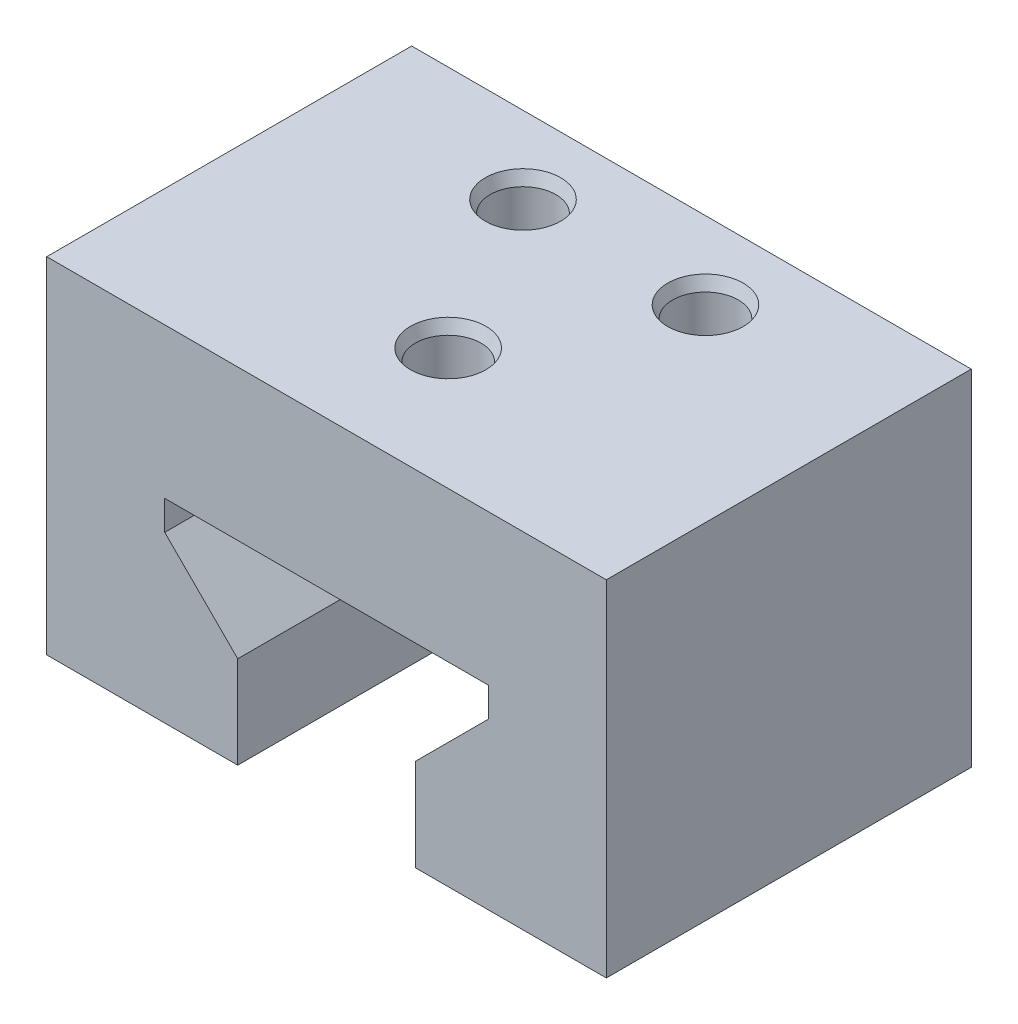
ISO-10303-21;
HEADER;
FILE_DESCRIPTION(('STEP AP214'),'2;1');
FILE_NAME('part.step','',(''),(''),'','','');
FILE_SCHEMA(('AUTOMOTIVE_DESIGN { 1 0 10303 214 1 1 1 1 }'));
ENDSEC;
DATA;
#1=APPLICATION_CONTEXT('core data for automotive mechanical design processes');
#2=APPLICATION_PROTOCOL_DEFINITION('international standard','automotive_design',2000,#1);
#3=PRODUCT_CONTEXT('',#1,'mechanical');
#4=PRODUCT('Part','Part','',(#3));
#5=PRODUCT_RELATED_PRODUCT_CATEGORY('part','',(#4));
#6=PRODUCT_DEFINITION_FORMATION('','',#4);
#7=PRODUCT_DEFINITION_CONTEXT('part definition',#1,'design');
#8=PRODUCT_DEFINITION('design','',#6,#7);
#9=PRODUCT_DEFINITION_SHAPE('','',#8);
#10=(LENGTH_UNIT() NAMED_UNIT(*) SI_UNIT(.MILLI.,.METRE.));
#11=(NAMED_UNIT(*) PLANE_ANGLE_UNIT() SI_UNIT($,.RADIAN.));
#12=(NAMED_UNIT(*) SI_UNIT($,.STERADIAN.) SOLID_ANGLE_UNIT());
#13=UNCERTAINTY_MEASURE_WITH_UNIT(LENGTH_MEASURE(1.E-05),#10,'distance_accuracy_value','');
#14=(GEOMETRIC_REPRESENTATION_CONTEXT(3) GLOBAL_UNCERTAINTY_ASSIGNED_CONTEXT((#13)) GLOBAL_UNIT_ASSIGNED_CONTEXT((#10,
#11,#12)) REPRESENTATION_CONTEXT('',''));
#15=CARTESIAN_POINT('',(0.,0.,0.));
#16=DIRECTION('',(0.,0.,1.));
#17=DIRECTION('',(1.,0.,0.));
#18=AXIS2_PLACEMENT_3D('',#15,#16,#17);
#19=CARTESIAN_POINT('',(23.,28.65,30.));
#20=DIRECTION('',(0.,-1.,0.));
#21=DIRECTION('',(0.,0.,-1.));
#22=AXIS2_PLACEMENT_3D('',#19,#20,#21);
#23=PLANE('',#22);
#24=CARTESIAN_POINT('',(0.,28.65,20.));
#25=DIRECTION('',(0.,1.,0.));
#26=DIRECTION('',(0.,0.,1.));
#27=AXIS2_PLACEMENT_3D('',#24,#25,#26);
#28=CIRCLE('',#27,3.10000000000001);
#29=CARTESIAN_POINT('',(0.,28.65,23.1));
#30=VERTEX_POINT('',#29);
#31=EDGE_CURVE('E324',#30,#30,#28,.T.);
#32=ORIENTED_EDGE('',*,*,#31,.F.);
#33=EDGE_LOOP('',(#32));
#34=FACE_BOUND('',#33,.T.);
#35=DIRECTION('',(-1.,0.,0.));
#36=VECTOR('',#35,1.);
#37=CARTESIAN_POINT('',(23.,28.65,0.));
#38=LINE('',#37,#36);
#39=CARTESIAN_POINT('',(23.,28.65,0.));
#40=VERTEX_POINT('',#39);
#41=CARTESIAN_POINT('',(-23.,28.65,0.));
#42=VERTEX_POINT('',#41);
#43=EDGE_CURVE('E100',#40,#42,#38,.T.);
#44=ORIENTED_EDGE('',*,*,#43,.T.);
#45=DIRECTION('',(0.,0.,-1.));
#46=VECTOR('',#45,1.);
#47=CARTESIAN_POINT('',(-23.,28.65,30.));
#48=LINE('',#47,#46);
#49=CARTESIAN_POINT('',(-23.,28.65,30.));
#50=VERTEX_POINT('',#49);
#51=EDGE_CURVE('E155',#50,#42,#48,.T.);
#52=ORIENTED_EDGE('',*,*,#51,.F.);
#53=DIRECTION('',(-1.,0.,0.));
#54=VECTOR('',#53,1.);
#55=CARTESIAN_POINT('',(23.,28.65,30.));
#56=LINE('',#55,#54);
#57=CARTESIAN_POINT('',(23.,28.65,30.));
#58=VERTEX_POINT('',#57);
#59=EDGE_CURVE('E143',#58,#50,#56,.T.);
#60=ORIENTED_EDGE('',*,*,#59,.F.);
#61=DIRECTION('',(0.,0.,-1.));
#62=VECTOR('',#61,1.);
#63=CARTESIAN_POINT('',(23.,28.65,30.));
#64=LINE('',#63,#62);
#65=EDGE_CURVE('E150',#58,#40,#64,.T.);
#66=ORIENTED_EDGE('',*,*,#65,.T.);
#67=EDGE_LOOP('',(#44,#52,#60,#66));
#68=FACE_BOUND('',#67,.T.);
#69=CARTESIAN_POINT('',(7.5,28.65,6.35));
#70=DIRECTION('',(0.,1.,0.));
#71=DIRECTION('',(0.,0.,1.));
#72=AXIS2_PLACEMENT_3D('',#69,#70,#71);
#73=CIRCLE('',#72,3.10000000000001);
#74=CARTESIAN_POINT('',(7.5,28.65,9.45000000000001));
#75=VERTEX_POINT('',#74);
#76=EDGE_CURVE('E316',#75,#75,#73,.T.);
#77=ORIENTED_EDGE('',*,*,#76,.F.);
#78=EDGE_LOOP('',(#77));
#79=FACE_BOUND('',#78,.T.);
#80=CARTESIAN_POINT('',(-7.5,28.65,6.35));
#81=DIRECTION('',(0.,1.,0.));
#82=DIRECTION('',(0.,0.,1.));
#83=AXIS2_PLACEMENT_3D('',#80,#81,#82);
#84=CIRCLE('',#83,3.10000000000001);
#85=CARTESIAN_POINT('',(-7.5,28.65,9.45000000000001));
#86=VERTEX_POINT('',#85);
#87=EDGE_CURVE('E365',#86,#86,#84,.T.);
#88=ORIENTED_EDGE('',*,*,#87,.F.);
#89=EDGE_LOOP('',(#88));
#90=FACE_BOUND('',#89,.T.);
#91=ADVANCED_FACE('F41',(#34,#68,#79,#90),#23,.F.);
#92=CARTESIAN_POINT('',(-23.,0.3,30.));
#93=DIRECTION('',(0.,1.,0.));
#94=DIRECTION('',(0.,0.,1.));
#95=AXIS2_PLACEMENT_3D('',#92,#93,#94);
#96=PLANE('',#95);
#97=DIRECTION('',(1.,0.,0.));
#98=VECTOR('',#97,1.);
#99=CARTESIAN_POINT('',(-23.,0.3,0.));
#100=LINE('',#99,#98);
#101=CARTESIAN_POINT('',(-23.,0.3,0.));
#102=VERTEX_POINT('',#101);
#103=CARTESIAN_POINT('',(-7.3,0.3,0.));
#104=VERTEX_POINT('',#103);
#105=EDGE_CURVE('E163',#102,#104,#100,.T.);
#106=ORIENTED_EDGE('',*,*,#105,.T.);
#107=DIRECTION('',(0.,0.,-1.));
#108=VECTOR('',#107,1.);
#109=CARTESIAN_POINT('',(-7.3,0.3,30.));
#110=LINE('',#109,#108);
#111=CARTESIAN_POINT('',(-7.3,0.3,30.));
#112=VERTEX_POINT('',#111);
#113=EDGE_CURVE('E11',#112,#104,#110,.T.);
#114=ORIENTED_EDGE('',*,*,#113,.F.);
#115=DIRECTION('',(1.,0.,0.));
#116=VECTOR('',#115,1.);
#117=CARTESIAN_POINT('',(-23.,0.3,30.));
#118=LINE('',#117,#116);
#119=CARTESIAN_POINT('',(-23.,0.3,30.));
#120=VERTEX_POINT('',#119);
#121=EDGE_CURVE('E186',#120,#112,#118,.T.);
#122=ORIENTED_EDGE('',*,*,#121,.F.);
#123=DIRECTION('',(0.,0.,-1.));
#124=VECTOR('',#123,1.);
#125=CARTESIAN_POINT('',(-23.,0.3,30.));
#126=LINE('',#125,#124);
#127=EDGE_CURVE('E159',#120,#102,#126,.T.);
#128=ORIENTED_EDGE('',*,*,#127,.T.);
#129=EDGE_LOOP('',(#106,#114,#122,#128));
#130=FACE_BOUND('',#129,.T.);
#131=ADVANCED_FACE('F252',(#130),#96,.F.);
#132=CARTESIAN_POINT('',(-7.3,0.3,30.));
#133=DIRECTION('',(-1.,0.,0.));
#134=DIRECTION('',(0.,0.,1.));
#135=AXIS2_PLACEMENT_3D('',#132,#133,#134);
#136=PLANE('',#135);
#137=DIRECTION('',(0.,1.,0.));
#138=VECTOR('',#137,1.);
#139=CARTESIAN_POINT('',(-7.3,0.3,0.));
#140=LINE('',#139,#138);
#141=CARTESIAN_POINT('',(-7.3,7.87573593128807,0.));
#142=VERTEX_POINT('',#141);
#143=EDGE_CURVE('E166',#104,#142,#140,.T.);
#144=ORIENTED_EDGE('',*,*,#143,.T.);
#145=DIRECTION('',(0.,0.,-1.));
#146=VECTOR('',#145,1.);
#147=CARTESIAN_POINT('',(-7.3,7.87573593128807,30.));
#148=LINE('',#147,#146);
#149=CARTESIAN_POINT('',(-7.3,7.87573593128807,30.));
#150=VERTEX_POINT('',#149);
#151=EDGE_CURVE('E51',#150,#142,#148,.T.);
#152=ORIENTED_EDGE('',*,*,#151,.F.);
#153=DIRECTION('',(0.,1.,0.));
#154=VECTOR('',#153,1.);
#155=CARTESIAN_POINT('',(-7.3,0.3,30.));
#156=LINE('',#155,#154);
#157=EDGE_CURVE('E114',#112,#150,#156,.T.);
#158=ORIENTED_EDGE('',*,*,#157,.F.);
#159=ORIENTED_EDGE('',*,*,#113,.T.);
#160=EDGE_LOOP('',(#144,#152,#158,#159));
#161=FACE_BOUND('',#160,.T.);
#162=ADVANCED_FACE('F272',(#161),#136,.F.);
#163=CARTESIAN_POINT('',(-7.3,7.87573593128807,30.));
#164=DIRECTION('',(-0.707106781186547,-0.707106781186548,0.));
#165=DIRECTION('',(0.707106781186548,-0.707106781186547,0.));
#166=AXIS2_PLACEMENT_3D('',#163,#164,#165);
#167=PLANE('',#166);
#168=DIRECTION('',(-0.707106781186548,0.707106781186547,0.));
#169=VECTOR('',#168,1.);
#170=CARTESIAN_POINT('',(-7.3,7.87573593128807,0.));
#171=LINE('',#170,#169);
#172=CARTESIAN_POINT('',(-13.3,13.8757359312881,0.));
#173=VERTEX_POINT('',#172);
#174=EDGE_CURVE('E169',#142,#173,#171,.T.);
#175=ORIENTED_EDGE('',*,*,#174,.T.);
#176=DIRECTION('',(0.,0.,-1.));
#177=VECTOR('',#176,1.);
#178=CARTESIAN_POINT('',(-13.3,13.8757359312881,30.));
#179=LINE('',#178,#177);
#180=CARTESIAN_POINT('',(-13.3,13.8757359312881,30.));
#181=VERTEX_POINT('',#180);
#182=EDGE_CURVE('E205',#181,#173,#179,.T.);
#183=ORIENTED_EDGE('',*,*,#182,.F.);
#184=DIRECTION('',(-0.707106781186548,0.707106781186547,0.));
#185=VECTOR('',#184,1.);
#186=CARTESIAN_POINT('',(-7.3,7.87573593128807,30.));
#187=LINE('',#186,#185);
#188=EDGE_CURVE('E213',#150,#181,#187,.T.);
#189=ORIENTED_EDGE('',*,*,#188,.F.);
#190=ORIENTED_EDGE('',*,*,#151,.T.);
#191=EDGE_LOOP('',(#175,#183,#189,#190));
#192=FACE_BOUND('',#191,.T.);
#193=ADVANCED_FACE('F211',(#192),#167,.F.);
#194=CARTESIAN_POINT('',(-13.3,13.8757359312881,30.));
#195=DIRECTION('',(-1.,0.,0.));
#196=DIRECTION('',(0.,0.,1.));
#197=AXIS2_PLACEMENT_3D('',#194,#195,#196);
#198=PLANE('',#197);
#199=DIRECTION('',(0.,1.,0.));
#200=VECTOR('',#199,1.);
#201=CARTESIAN_POINT('',(-13.3,13.8757359312881,0.));
#202=LINE('',#201,#200);
#203=CARTESIAN_POINT('',(-13.3,16.3,0.));
#204=VERTEX_POINT('',#203);
#205=EDGE_CURVE('E171',#173,#204,#202,.T.);
#206=ORIENTED_EDGE('',*,*,#205,.T.);
#207=DIRECTION('',(0.,0.,-1.));
#208=VECTOR('',#207,1.);
#209=CARTESIAN_POINT('',(-13.3,16.3,30.));
#210=LINE('',#209,#208);
#211=CARTESIAN_POINT('',(-13.3,16.3,30.));
#212=VERTEX_POINT('',#211);
#213=EDGE_CURVE('E202',#212,#204,#210,.T.);
#214=ORIENTED_EDGE('',*,*,#213,.F.);
#215=DIRECTION('',(0.,1.,0.));
#216=VECTOR('',#215,1.);
#217=CARTESIAN_POINT('',(-13.3,13.8757359312881,30.));
#218=LINE('',#217,#216);
#219=EDGE_CURVE('E231',#181,#212,#218,.T.);
#220=ORIENTED_EDGE('',*,*,#219,.F.);
#221=ORIENTED_EDGE('',*,*,#182,.T.);
#222=EDGE_LOOP('',(#206,#214,#220,#221));
#223=FACE_BOUND('',#222,.T.);
#224=ADVANCED_FACE('F222',(#223),#198,.F.);
#225=CARTESIAN_POINT('',(-13.3,16.3,30.));
#226=DIRECTION('',(0.,1.,0.));
#227=DIRECTION('',(0.,0.,1.));
#228=AXIS2_PLACEMENT_3D('',#225,#226,#227);
#229=PLANE('',#228);
#230=CARTESIAN_POINT('',(-7.5,16.3,6.35));
#231=DIRECTION('',(0.,1.,0.));
#232=DIRECTION('',(0.,0.,1.));
#233=AXIS2_PLACEMENT_3D('',#230,#231,#232);
#234=CIRCLE('',#233,2.70000000000001);
#235=CARTESIAN_POINT('',(-7.5,16.3,9.05000000000001));
#236=VERTEX_POINT('',#235);
#237=EDGE_CURVE('E326',#236,#236,#234,.T.);
#238=ORIENTED_EDGE('',*,*,#237,.T.);
#239=EDGE_LOOP('',(#238));
#240=FACE_BOUND('',#239,.T.);
#241=CARTESIAN_POINT('',(7.5,16.3,6.35));
#242=DIRECTION('',(0.,1.,0.));
#243=DIRECTION('',(0.,0.,1.));
#244=AXIS2_PLACEMENT_3D('',#241,#242,#243);
#245=CIRCLE('',#244,2.70000000000001);
#246=CARTESIAN_POINT('',(7.5,16.3,9.05000000000001));
#247=VERTEX_POINT('',#246);
#248=EDGE_CURVE('E321',#247,#247,#245,.T.);
#249=ORIENTED_EDGE('',*,*,#248,.T.);
#250=EDGE_LOOP('',(#249));
#251=FACE_BOUND('',#250,.T.);
#252=CARTESIAN_POINT('',(0.,16.3,20.));
#253=DIRECTION('',(0.,1.,0.));
#254=DIRECTION('',(0.,0.,1.));
#255=AXIS2_PLACEMENT_3D('',#252,#253,#254);
#256=CIRCLE('',#255,2.70000000000001);
#257=CARTESIAN_POINT('',(0.,16.3,22.7));
#258=VERTEX_POINT('',#257);
#259=EDGE_CURVE('E167',#258,#258,#256,.T.);
#260=ORIENTED_EDGE('',*,*,#259,.T.);
#261=EDGE_LOOP('',(#260));
#262=FACE_BOUND('',#261,.T.);
#263=DIRECTION('',(1.,0.,0.));
#264=VECTOR('',#263,1.);
#265=CARTESIAN_POINT('',(-13.3,16.3,0.));
#266=LINE('',#265,#264);
#267=CARTESIAN_POINT('',(13.3,16.3,0.));
#268=VERTEX_POINT('',#267);
#269=EDGE_CURVE('E173',#204,#268,#266,.T.);
#270=ORIENTED_EDGE('',*,*,#269,.T.);
#271=DIRECTION('',(0.,0.,-1.));
#272=VECTOR('',#271,1.);
#273=CARTESIAN_POINT('',(13.3,16.3,30.));
#274=LINE('',#273,#272);
#275=CARTESIAN_POINT('',(13.3,16.3,30.));
#276=VERTEX_POINT('',#275);
#277=EDGE_CURVE('E199',#276,#268,#274,.T.);
#278=ORIENTED_EDGE('',*,*,#277,.F.);
#279=DIRECTION('',(1.,0.,0.));
#280=VECTOR('',#279,1.);
#281=CARTESIAN_POINT('',(-13.3,16.3,30.));
#282=LINE('',#281,#280);
#283=EDGE_CURVE('E228',#212,#276,#282,.T.);
#284=ORIENTED_EDGE('',*,*,#283,.F.);
#285=ORIENTED_EDGE('',*,*,#213,.T.);
#286=EDGE_LOOP('',(#270,#278,#284,#285));
#287=FACE_BOUND('',#286,.T.);
#288=ADVANCED_FACE('F226',(#240,#251,#262,#287),#229,.F.);
#289=CARTESIAN_POINT('',(13.3,16.3,30.));
#290=DIRECTION('',(1.,0.,0.));
#291=DIRECTION('',(0.,0.,-1.));
#292=AXIS2_PLACEMENT_3D('',#289,#290,#291);
#293=PLANE('',#292);
#294=DIRECTION('',(0.,-1.,0.));
#295=VECTOR('',#294,1.);
#296=CARTESIAN_POINT('',(13.3,16.3,0.));
#297=LINE('',#296,#295);
#298=CARTESIAN_POINT('',(13.3,13.8757359312881,0.));
#299=VERTEX_POINT('',#298);
#300=EDGE_CURVE('E175',#268,#299,#297,.T.);
#301=ORIENTED_EDGE('',*,*,#300,.T.);
#302=DIRECTION('',(0.,0.,-1.));
#303=VECTOR('',#302,1.);
#304=CARTESIAN_POINT('',(13.3,13.8757359312881,30.));
#305=LINE('',#304,#303);
#306=CARTESIAN_POINT('',(13.3,13.8757359312881,30.));
#307=VERTEX_POINT('',#306);
#308=EDGE_CURVE('E196',#307,#299,#305,.T.);
#309=ORIENTED_EDGE('',*,*,#308,.F.);
#310=DIRECTION('',(0.,-1.,0.));
#311=VECTOR('',#310,1.);
#312=CARTESIAN_POINT('',(13.3,16.3,30.));
#313=LINE('',#312,#311);
#314=EDGE_CURVE('E230',#276,#307,#313,.T.);
#315=ORIENTED_EDGE('',*,*,#314,.F.);
#316=ORIENTED_EDGE('',*,*,#277,.T.);
#317=EDGE_LOOP('',(#301,#309,#315,#316));
#318=FACE_BOUND('',#317,.T.);
#319=ADVANCED_FACE('F283',(#318),#293,.F.);
#320=CARTESIAN_POINT('',(13.3,13.8757359312881,30.));
#321=DIRECTION('',(0.707106781186547,-0.707106781186548,0.));
#322=DIRECTION('',(0.707106781186548,0.707106781186547,0.));
#323=AXIS2_PLACEMENT_3D('',#320,#321,#322);
#324=PLANE('',#323);
#325=DIRECTION('',(-0.707106781186548,-0.707106781186547,0.));
#326=VECTOR('',#325,1.);
#327=CARTESIAN_POINT('',(13.3,13.8757359312881,0.));
#328=LINE('',#327,#326);
#329=CARTESIAN_POINT('',(7.3,7.87573593128807,0.));
#330=VERTEX_POINT('',#329);
#331=EDGE_CURVE('E177',#299,#330,#328,.T.);
#332=ORIENTED_EDGE('',*,*,#331,.T.);
#333=DIRECTION('',(0.,0.,-1.));
#334=VECTOR('',#333,1.);
#335=CARTESIAN_POINT('',(7.3,7.87573593128807,30.));
#336=LINE('',#335,#334);
#337=CARTESIAN_POINT('',(7.3,7.87573593128807,30.));
#338=VERTEX_POINT('',#337);
#339=EDGE_CURVE('E193',#338,#330,#336,.T.);
#340=ORIENTED_EDGE('',*,*,#339,.F.);
#341=DIRECTION('',(-0.707106781186548,-0.707106781186547,0.));
#342=VECTOR('',#341,1.);
#343=CARTESIAN_POINT('',(13.3,13.8757359312881,30.));
#344=LINE('',#343,#342);
#345=EDGE_CURVE('E233',#307,#338,#344,.T.);
#346=ORIENTED_EDGE('',*,*,#345,.F.);
#347=ORIENTED_EDGE('',*,*,#308,.T.);
#348=EDGE_LOOP('',(#332,#340,#346,#347));
#349=FACE_BOUND('',#348,.T.);
#350=ADVANCED_FACE('F280',(#349),#324,.F.);
#351=CARTESIAN_POINT('',(7.3,7.87573593128807,30.));
#352=DIRECTION('',(1.,0.,0.));
#353=DIRECTION('',(0.,1.,0.));
#354=AXIS2_PLACEMENT_3D('',#351,#352,#353);
#355=PLANE('',#354);
#356=DIRECTION('',(0.,-1.,0.));
#357=VECTOR('',#356,1.);
#358=CARTESIAN_POINT('',(7.3,7.87573593128807,0.));
#359=LINE('',#358,#357);
#360=CARTESIAN_POINT('',(7.3,0.3,0.));
#361=VERTEX_POINT('',#360);
#362=EDGE_CURVE('E179',#330,#361,#359,.T.);
#363=ORIENTED_EDGE('',*,*,#362,.T.);
#364=DIRECTION('',(0.,0.,-1.));
#365=VECTOR('',#364,1.);
#366=CARTESIAN_POINT('',(7.3,0.3,30.));
#367=LINE('',#366,#365);
#368=CARTESIAN_POINT('',(7.3,0.3,30.));
#369=VERTEX_POINT('',#368);
#370=EDGE_CURVE('E190',#369,#361,#367,.T.);
#371=ORIENTED_EDGE('',*,*,#370,.F.);
#372=DIRECTION('',(0.,-1.,0.));
#373=VECTOR('',#372,1.);
#374=CARTESIAN_POINT('',(7.3,7.87573593128807,30.));
#375=LINE('',#374,#373);
#376=EDGE_CURVE('E239',#338,#369,#375,.T.);
#377=ORIENTED_EDGE('',*,*,#376,.F.);
#378=ORIENTED_EDGE('',*,*,#339,.T.);
#379=EDGE_LOOP('',(#363,#371,#377,#378));
#380=FACE_BOUND('',#379,.T.);
#381=ADVANCED_FACE('F245',(#380),#355,.F.);
#382=CARTESIAN_POINT('',(7.3,0.3,30.));
#383=DIRECTION('',(0.,1.,0.));
#384=DIRECTION('',(0.,0.,1.));
#385=AXIS2_PLACEMENT_3D('',#382,#383,#384);
#386=PLANE('',#385);
#387=DIRECTION('',(1.,0.,0.));
#388=VECTOR('',#387,1.);
#389=CARTESIAN_POINT('',(7.3,0.3,0.));
#390=LINE('',#389,#388);
#391=CARTESIAN_POINT('',(23.,0.3,0.));
#392=VERTEX_POINT('',#391);
#393=EDGE_CURVE('E181',#361,#392,#390,.T.);
#394=ORIENTED_EDGE('',*,*,#393,.T.);
#395=DIRECTION('',(0.,0.,-1.));
#396=VECTOR('',#395,1.);
#397=CARTESIAN_POINT('',(23.,0.3,30.));
#398=LINE('',#397,#396);
#399=CARTESIAN_POINT('',(23.,0.3,30.));
#400=VERTEX_POINT('',#399);
#401=EDGE_CURVE('E154',#400,#392,#398,.T.);
#402=ORIENTED_EDGE('',*,*,#401,.F.);
#403=DIRECTION('',(1.,0.,0.));
#404=VECTOR('',#403,1.);
#405=CARTESIAN_POINT('',(7.3,0.3,30.));
#406=LINE('',#405,#404);
#407=EDGE_CURVE('E145',#369,#400,#406,.T.);
#408=ORIENTED_EDGE('',*,*,#407,.F.);
#409=ORIENTED_EDGE('',*,*,#370,.T.);
#410=EDGE_LOOP('',(#394,#402,#408,#409));
#411=FACE_BOUND('',#410,.T.);
#412=ADVANCED_FACE('F249',(#411),#386,.F.);
#413=CARTESIAN_POINT('',(23.,0.3,30.));
#414=DIRECTION('',(-1.,0.,0.));
#415=DIRECTION('',(0.,0.,1.));
#416=AXIS2_PLACEMENT_3D('',#413,#414,#415);
#417=PLANE('',#416);
#418=DIRECTION('',(0.,1.,0.));
#419=VECTOR('',#418,1.);
#420=CARTESIAN_POINT('',(23.,0.3,0.));
#421=LINE('',#420,#419);
#422=EDGE_CURVE('E153',#392,#40,#421,.T.);
#423=ORIENTED_EDGE('',*,*,#422,.T.);
#424=ORIENTED_EDGE('',*,*,#65,.F.);
#425=DIRECTION('',(0.,1.,0.));
#426=VECTOR('',#425,1.);
#427=CARTESIAN_POINT('',(23.,0.3,30.));
#428=LINE('',#427,#426);
#429=EDGE_CURVE('E139',#400,#58,#428,.T.);
#430=ORIENTED_EDGE('',*,*,#429,.F.);
#431=ORIENTED_EDGE('',*,*,#401,.T.);
#432=EDGE_LOOP('',(#423,#424,#430,#431));
#433=FACE_BOUND('',#432,.T.);
#434=ADVANCED_FACE('F151',(#433),#417,.F.);
#435=CARTESIAN_POINT('',(-23.,28.65,30.));
#436=DIRECTION('',(1.,0.,0.));
#437=DIRECTION('',(0.,1.,0.));
#438=AXIS2_PLACEMENT_3D('',#435,#436,#437);
#439=PLANE('',#438);
#440=DIRECTION('',(0.,-1.,0.));
#441=VECTOR('',#440,1.);
#442=CARTESIAN_POINT('',(-23.,28.65,0.));
#443=LINE('',#442,#441);
#444=EDGE_CURVE('E106',#42,#102,#443,.T.);
#445=ORIENTED_EDGE('',*,*,#444,.T.);
#446=ORIENTED_EDGE('',*,*,#127,.F.);
#447=DIRECTION('',(0.,-1.,0.));
#448=VECTOR('',#447,1.);
#449=CARTESIAN_POINT('',(-23.,28.65,30.));
#450=LINE('',#449,#448);
#451=EDGE_CURVE('E59',#50,#120,#450,.T.);
#452=ORIENTED_EDGE('',*,*,#451,.F.);
#453=ORIENTED_EDGE('',*,*,#51,.T.);
#454=EDGE_LOOP('',(#445,#446,#452,#453));
#455=FACE_BOUND('',#454,.T.);
#456=ADVANCED_FACE('F254',(#455),#439,.F.);
#457=CARTESIAN_POINT('',(0.,0.,30.));
#458=DIRECTION('',(0.,0.,1.));
#459=DIRECTION('',(1.,0.,0.));
#460=AXIS2_PLACEMENT_3D('',#457,#458,#459);
#461=PLANE('',#460);
#462=ORIENTED_EDGE('',*,*,#121,.T.);
#463=ORIENTED_EDGE('',*,*,#157,.T.);
#464=ORIENTED_EDGE('',*,*,#188,.T.);
#465=ORIENTED_EDGE('',*,*,#219,.T.);
#466=ORIENTED_EDGE('',*,*,#283,.T.);
#467=ORIENTED_EDGE('',*,*,#314,.T.);
#468=ORIENTED_EDGE('',*,*,#345,.T.);
#469=ORIENTED_EDGE('',*,*,#376,.T.);
#470=ORIENTED_EDGE('',*,*,#407,.T.);
#471=ORIENTED_EDGE('',*,*,#429,.T.);
#472=ORIENTED_EDGE('',*,*,#59,.T.);
#473=ORIENTED_EDGE('',*,*,#451,.T.);
#474=EDGE_LOOP('',(#462,#463,#464,#465,#466,#467,#468,#469,#470,#471,#472,#473));
#475=FACE_BOUND('',#474,.T.);
#476=ADVANCED_FACE('F141',(#475),#461,.T.);
#477=CARTESIAN_POINT('',(0.,0.,0.));
#478=DIRECTION('',(0.,0.,1.));
#479=DIRECTION('',(1.,0.,0.));
#480=AXIS2_PLACEMENT_3D('',#477,#478,#479);
#481=PLANE('',#480);
#482=ORIENTED_EDGE('',*,*,#105,.F.);
#483=ORIENTED_EDGE('',*,*,#444,.F.);
#484=ORIENTED_EDGE('',*,*,#43,.F.);
#485=ORIENTED_EDGE('',*,*,#422,.F.);
#486=ORIENTED_EDGE('',*,*,#393,.F.);
#487=ORIENTED_EDGE('',*,*,#362,.F.);
#488=ORIENTED_EDGE('',*,*,#331,.F.);
#489=ORIENTED_EDGE('',*,*,#300,.F.);
#490=ORIENTED_EDGE('',*,*,#269,.F.);
#491=ORIENTED_EDGE('',*,*,#205,.F.);
#492=ORIENTED_EDGE('',*,*,#174,.F.);
#493=ORIENTED_EDGE('',*,*,#143,.F.);
#494=EDGE_LOOP('',(#482,#483,#484,#485,#486,#487,#488,#489,#490,#491,#492,#493));
#495=FACE_BOUND('',#494,.T.);
#496=ADVANCED_FACE('F217',(#495),#481,.F.);
#497=CARTESIAN_POINT('',(0.,28.65,20.));
#498=DIRECTION('',(0.,1.,0.));
#499=DIRECTION('',(0.,0.,1.));
#500=AXIS2_PLACEMENT_3D('',#497,#498,#499);
#501=CYLINDRICAL_SURFACE('',#500,2.70000000000001);
#502=ORIENTED_EDGE('',*,*,#259,.F.);
#503=EDGE_LOOP('',(#502));
#504=FACE_BOUND('',#503,.T.);
#505=CARTESIAN_POINT('',(0.,27.65,20.));
#506=DIRECTION('',(0.,1.,0.));
#507=DIRECTION('',(0.,0.,1.));
#508=AXIS2_PLACEMENT_3D('',#505,#506,#507);
#509=CIRCLE('',#508,2.70000000000001);
#510=CARTESIAN_POINT('',(0.,27.65,22.7));
#511=VERTEX_POINT('',#510);
#512=EDGE_CURVE('E332',#511,#511,#509,.T.);
#513=ORIENTED_EDGE('',*,*,#512,.T.);
#514=EDGE_LOOP('',(#513));
#515=FACE_BOUND('',#514,.T.);
#516=ADVANCED_FACE('F341',(#504,#515),#501,.F.);
#517=CARTESIAN_POINT('',(7.5,28.65,6.35));
#518=DIRECTION('',(0.,1.,0.));
#519=DIRECTION('',(0.,0.,1.));
#520=AXIS2_PLACEMENT_3D('',#517,#518,#519);
#521=CYLINDRICAL_SURFACE('',#520,2.70000000000001);
#522=ORIENTED_EDGE('',*,*,#248,.F.);
#523=EDGE_LOOP('',(#522));
#524=FACE_BOUND('',#523,.T.);
#525=CARTESIAN_POINT('',(7.5,27.65,6.35));
#526=DIRECTION('',(0.,1.,0.));
#527=DIRECTION('',(0.,0.,1.));
#528=AXIS2_PLACEMENT_3D('',#525,#526,#527);
#529=CIRCLE('',#528,2.70000000000001);
#530=CARTESIAN_POINT('',(7.5,27.65,9.05000000000001));
#531=VERTEX_POINT('',#530);
#532=EDGE_CURVE('E319',#531,#531,#529,.T.);
#533=ORIENTED_EDGE('',*,*,#532,.T.);
#534=EDGE_LOOP('',(#533));
#535=FACE_BOUND('',#534,.T.);
#536=ADVANCED_FACE('F344',(#524,#535),#521,.F.);
#537=CARTESIAN_POINT('',(-7.5,28.65,6.35));
#538=DIRECTION('',(0.,1.,0.));
#539=DIRECTION('',(0.,0.,1.));
#540=AXIS2_PLACEMENT_3D('',#537,#538,#539);
#541=CYLINDRICAL_SURFACE('',#540,2.70000000000001);
#542=ORIENTED_EDGE('',*,*,#237,.F.);
#543=EDGE_LOOP('',(#542));
#544=FACE_BOUND('',#543,.T.);
#545=CARTESIAN_POINT('',(-7.5,27.65,6.35));
#546=DIRECTION('',(0.,1.,0.));
#547=DIRECTION('',(0.,0.,1.));
#548=AXIS2_PLACEMENT_3D('',#545,#546,#547);
#549=CIRCLE('',#548,2.70000000000001);
#550=CARTESIAN_POINT('',(-7.5,27.65,9.05000000000001));
#551=VERTEX_POINT('',#550);
#552=EDGE_CURVE('E363',#551,#551,#549,.T.);
#553=ORIENTED_EDGE('',*,*,#552,.T.);
#554=EDGE_LOOP('',(#553));
#555=FACE_BOUND('',#554,.T.);
#556=ADVANCED_FACE('F303',(#544,#555),#541,.F.);
#557=CARTESIAN_POINT('',(0.,27.65,20.));
#558=DIRECTION('',(0.,1.,0.));
#559=DIRECTION('',(0.,0.,1.));
#560=AXIS2_PLACEMENT_3D('',#557,#558,#559);
#561=CONICAL_SURFACE('',#560,2.70000000000003,0.380506377112367);
#562=ORIENTED_EDGE('',*,*,#31,.T.);
#563=EDGE_LOOP('',(#562));
#564=FACE_BOUND('',#563,.T.);
#565=ORIENTED_EDGE('',*,*,#512,.F.);
#566=EDGE_LOOP('',(#565));
#567=FACE_BOUND('',#566,.T.);
#568=ADVANCED_FACE('F297',(#564,#567),#561,.F.);
#569=CARTESIAN_POINT('',(7.5,27.65,6.35));
#570=DIRECTION('',(0.,1.,0.));
#571=DIRECTION('',(0.,0.,1.));
#572=AXIS2_PLACEMENT_3D('',#569,#570,#571);
#573=CONICAL_SURFACE('',#572,2.70000000000001,0.380506377112367);
#574=ORIENTED_EDGE('',*,*,#76,.T.);
#575=EDGE_LOOP('',(#574));
#576=FACE_BOUND('',#575,.T.);
#577=ORIENTED_EDGE('',*,*,#532,.F.);
#578=EDGE_LOOP('',(#577));
#579=FACE_BOUND('',#578,.T.);
#580=ADVANCED_FACE('F302',(#576,#579),#573,.F.);
#581=CARTESIAN_POINT('',(-7.5,27.65,6.35));
#582=DIRECTION('',(0.,1.,0.));
#583=DIRECTION('',(0.,0.,1.));
#584=AXIS2_PLACEMENT_3D('',#581,#582,#583);
#585=CONICAL_SURFACE('',#584,2.70000000000001,0.380506377112367);
#586=ORIENTED_EDGE('',*,*,#87,.T.);
#587=EDGE_LOOP('',(#586));
#588=FACE_BOUND('',#587,.T.);
#589=ORIENTED_EDGE('',*,*,#552,.F.);
#590=EDGE_LOOP('',(#589));
#591=FACE_BOUND('',#590,.T.);
#592=ADVANCED_FACE('F44',(#588,#591),#585,.F.);
#593=CLOSED_SHELL('',(#91,#131,#162,#193,#224,#288,#319,#350,#381,#412,#434,#456,#476,#496,#516,
#536,#556,#568,#580,#592));
#594=MANIFOLD_SOLID_BREP('B2',#593);
#595=ADVANCED_BREP_SHAPE_REPRESENTATION('',(#18,#594),#14);
#596=SHAPE_DEFINITION_REPRESENTATION(#9,#595);
ENDSEC;
END-ISO-10303-21;
